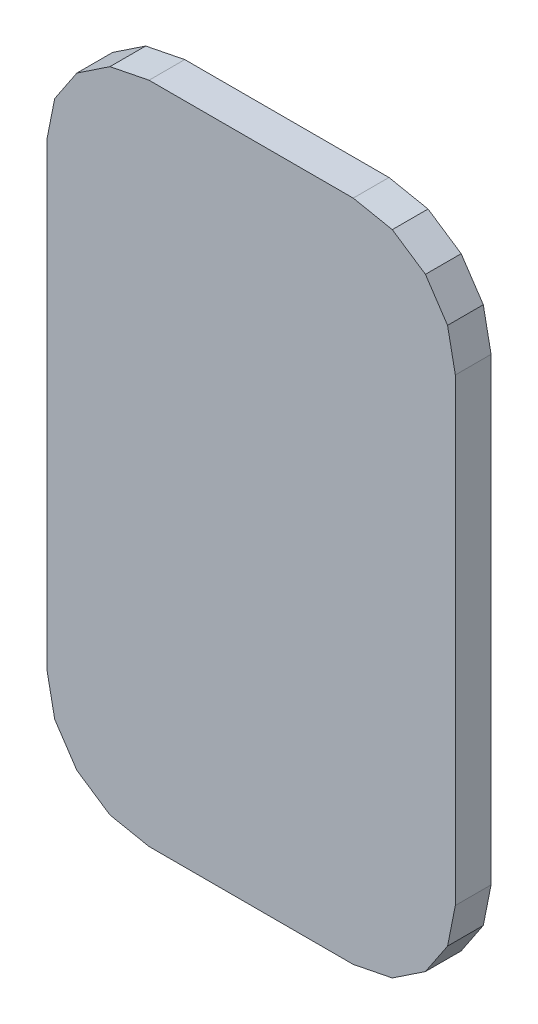
ISO-10303-21;
HEADER;
FILE_DESCRIPTION(('STEP AP214'),'2;1');
FILE_NAME('part.step','',(''),(''),'','','');
FILE_SCHEMA(('AUTOMOTIVE_DESIGN { 1 0 10303 214 1 1 1 1 }'));
ENDSEC;
DATA;
#1=APPLICATION_CONTEXT('core data for automotive mechanical design processes');
#2=APPLICATION_PROTOCOL_DEFINITION('international standard','automotive_design',2000,#1);
#3=PRODUCT_CONTEXT('',#1,'mechanical');
#4=PRODUCT('Part','Part','',(#3));
#5=PRODUCT_RELATED_PRODUCT_CATEGORY('part','',(#4));
#6=PRODUCT_DEFINITION_FORMATION('','',#4);
#7=PRODUCT_DEFINITION_CONTEXT('part definition',#1,'design');
#8=PRODUCT_DEFINITION('design','',#6,#7);
#9=PRODUCT_DEFINITION_SHAPE('','',#8);
#10=(LENGTH_UNIT() NAMED_UNIT(*) SI_UNIT(.MILLI.,.METRE.));
#11=(NAMED_UNIT(*) PLANE_ANGLE_UNIT() SI_UNIT($,.RADIAN.));
#12=(NAMED_UNIT(*) SI_UNIT($,.STERADIAN.) SOLID_ANGLE_UNIT());
#13=UNCERTAINTY_MEASURE_WITH_UNIT(LENGTH_MEASURE(1.E-05),#10,'distance_accuracy_value','');
#14=(GEOMETRIC_REPRESENTATION_CONTEXT(3) GLOBAL_UNCERTAINTY_ASSIGNED_CONTEXT((#13)) GLOBAL_UNIT_ASSIGNED_CONTEXT((#10,
#11,#12)) REPRESENTATION_CONTEXT('',''));
#15=CARTESIAN_POINT('',(0.,0.,0.));
#16=DIRECTION('',(0.,0.,1.));
#17=DIRECTION('',(1.,0.,0.));
#18=AXIS2_PLACEMENT_3D('',#15,#16,#17);
#19=CARTESIAN_POINT('',(88.5,-136.015,1.635));
#20=DIRECTION('',(0.,0.,-1.));
#21=DIRECTION('',(0.,-1.,0.));
#22=AXIS2_PLACEMENT_3D('',#19,#20,#21);
#23=PLANE('',#22);
#24=DIRECTION('',(0.980785174844701,-0.19509085269394,0.));
#25=VECTOR('',#24,1.);
#26=CARTESIAN_POINT('',(88.6,-135.69,1.635));
#27=LINE('',#26,#25);
#28=CARTESIAN_POINT('',(88.6,-135.69,1.635));
#29=VERTEX_POINT('',#28);
#30=CARTESIAN_POINT('',(88.638268,-135.697612,1.635));
#31=VERTEX_POINT('',#30);
#32=EDGE_CURVE('E20',#29,#31,#27,.T.);
#33=ORIENTED_EDGE('',*,*,#32,.F.);
#34=DIRECTION('',(1.,0.,0.));
#35=VECTOR('',#34,1.);
#36=CARTESIAN_POINT('',(88.4,-135.69,1.635));
#37=LINE('',#36,#35);
#38=CARTESIAN_POINT('',(88.4,-135.69,1.635));
#39=VERTEX_POINT('',#38);
#40=EDGE_CURVE('E377',#39,#29,#37,.T.);
#41=ORIENTED_EDGE('',*,*,#40,.F.);
#42=DIRECTION('',(0.980785174844701,0.19509085269394,0.));
#43=VECTOR('',#42,1.);
#44=CARTESIAN_POINT('',(88.361732,-135.697612,1.635));
#45=LINE('',#44,#43);
#46=CARTESIAN_POINT('',(88.361732,-135.697612,1.635));
#47=VERTEX_POINT('',#46);
#48=EDGE_CURVE('E349',#47,#39,#45,.T.);
#49=ORIENTED_EDGE('',*,*,#48,.F.);
#50=DIRECTION('',(0.831478130960079,0.555557483736053,0.));
#51=VECTOR('',#50,1.);
#52=CARTESIAN_POINT('',(88.329289,-135.719289,1.635));
#53=LINE('',#52,#51);
#54=CARTESIAN_POINT('',(88.329289,-135.719289,1.635));
#55=VERTEX_POINT('',#54);
#56=EDGE_CURVE('E417',#55,#47,#53,.T.);
#57=ORIENTED_EDGE('',*,*,#56,.F.);
#58=DIRECTION('',(0.555557483734899,0.831478130960849,0.));
#59=VECTOR('',#58,1.);
#60=CARTESIAN_POINT('',(88.307612,-135.751732,1.635));
#61=LINE('',#60,#59);
#62=CARTESIAN_POINT('',(88.307612,-135.751732,1.635));
#63=VERTEX_POINT('',#62);
#64=EDGE_CURVE('E257',#63,#55,#61,.T.);
#65=ORIENTED_EDGE('',*,*,#64,.F.);
#66=DIRECTION('',(0.195090852694903,0.98078517484451,0.));
#67=VECTOR('',#66,1.);
#68=CARTESIAN_POINT('',(88.3,-135.79,1.635));
#69=LINE('',#68,#67);
#70=CARTESIAN_POINT('',(88.3,-135.79,1.635));
#71=VERTEX_POINT('',#70);
#72=EDGE_CURVE('E402',#71,#63,#69,.T.);
#73=ORIENTED_EDGE('',*,*,#72,.F.);
#74=DIRECTION('',(0.,1.,0.));
#75=VECTOR('',#74,1.);
#76=CARTESIAN_POINT('',(88.3,-136.24,1.635));
#77=LINE('',#76,#75);
#78=CARTESIAN_POINT('',(88.3,-136.24,1.635));
#79=VERTEX_POINT('',#78);
#80=EDGE_CURVE('E390',#79,#71,#77,.T.);
#81=ORIENTED_EDGE('',*,*,#80,.F.);
#82=DIRECTION('',(-0.195090852694903,0.98078517484451,0.));
#83=VECTOR('',#82,1.);
#84=CARTESIAN_POINT('',(88.307612,-136.278268,1.635));
#85=LINE('',#84,#83);
#86=CARTESIAN_POINT('',(88.307612,-136.278268,1.635));
#87=VERTEX_POINT('',#86);
#88=EDGE_CURVE('E237',#87,#79,#85,.T.);
#89=ORIENTED_EDGE('',*,*,#88,.F.);
#90=DIRECTION('',(-0.555557483734899,0.831478130960849,0.));
#91=VECTOR('',#90,1.);
#92=CARTESIAN_POINT('',(88.329289,-136.310711,1.635));
#93=LINE('',#92,#91);
#94=CARTESIAN_POINT('',(88.329289,-136.310711,1.635));
#95=VERTEX_POINT('',#94);
#96=EDGE_CURVE('E361',#95,#87,#93,.T.);
#97=ORIENTED_EDGE('',*,*,#96,.F.);
#98=DIRECTION('',(-0.831478130960079,0.555557483736053,0.));
#99=VECTOR('',#98,1.);
#100=CARTESIAN_POINT('',(88.361732,-136.332388,1.635));
#101=LINE('',#100,#99);
#102=CARTESIAN_POINT('',(88.361732,-136.332388,1.635));
#103=VERTEX_POINT('',#102);
#104=EDGE_CURVE('E302',#103,#95,#101,.T.);
#105=ORIENTED_EDGE('',*,*,#104,.F.);
#106=DIRECTION('',(-0.980785174844701,0.19509085269394,0.));
#107=VECTOR('',#106,1.);
#108=CARTESIAN_POINT('',(88.4,-136.34,1.635));
#109=LINE('',#108,#107);
#110=CARTESIAN_POINT('',(88.4,-136.34,1.635));
#111=VERTEX_POINT('',#110);
#112=EDGE_CURVE('E226',#111,#103,#109,.T.);
#113=ORIENTED_EDGE('',*,*,#112,.F.);
#114=DIRECTION('',(-1.,0.,0.));
#115=VECTOR('',#114,1.);
#116=CARTESIAN_POINT('',(88.6,-136.34,1.635));
#117=LINE('',#116,#115);
#118=CARTESIAN_POINT('',(88.6,-136.34,1.635));
#119=VERTEX_POINT('',#118);
#120=EDGE_CURVE('E329',#119,#111,#117,.T.);
#121=ORIENTED_EDGE('',*,*,#120,.F.);
#122=DIRECTION('',(-0.980785174844701,-0.19509085269394,0.));
#123=VECTOR('',#122,1.);
#124=CARTESIAN_POINT('',(88.638268,-136.332388,1.635));
#125=LINE('',#124,#123);
#126=CARTESIAN_POINT('',(88.638268,-136.332388,1.635));
#127=VERTEX_POINT('',#126);
#128=EDGE_CURVE('E298',#127,#119,#125,.T.);
#129=ORIENTED_EDGE('',*,*,#128,.F.);
#130=DIRECTION('',(-0.831478130960079,-0.555557483736053,0.));
#131=VECTOR('',#130,1.);
#132=CARTESIAN_POINT('',(88.670711,-136.310711,1.635));
#133=LINE('',#132,#131);
#134=CARTESIAN_POINT('',(88.670711,-136.310711,1.635));
#135=VERTEX_POINT('',#134);
#136=EDGE_CURVE('E311',#135,#127,#133,.T.);
#137=ORIENTED_EDGE('',*,*,#136,.F.);
#138=DIRECTION('',(-0.555557483734899,-0.831478130960849,0.));
#139=VECTOR('',#138,1.);
#140=CARTESIAN_POINT('',(88.692388,-136.278268,1.635));
#141=LINE('',#140,#139);
#142=CARTESIAN_POINT('',(88.692388,-136.278268,1.635));
#143=VERTEX_POINT('',#142);
#144=EDGE_CURVE('E251',#143,#135,#141,.T.);
#145=ORIENTED_EDGE('',*,*,#144,.F.);
#146=DIRECTION('',(-0.195090852694903,-0.98078517484451,0.));
#147=VECTOR('',#146,1.);
#148=CARTESIAN_POINT('',(88.7,-136.24,1.635));
#149=LINE('',#148,#147);
#150=CARTESIAN_POINT('',(88.7,-136.24,1.635));
#151=VERTEX_POINT('',#150);
#152=EDGE_CURVE('E232',#151,#143,#149,.T.);
#153=ORIENTED_EDGE('',*,*,#152,.F.);
#154=DIRECTION('',(0.,-1.,0.));
#155=VECTOR('',#154,1.);
#156=CARTESIAN_POINT('',(88.7,-135.79,1.635));
#157=LINE('',#156,#155);
#158=CARTESIAN_POINT('',(88.7,-135.79,1.635));
#159=VERTEX_POINT('',#158);
#160=EDGE_CURVE('E276',#159,#151,#157,.T.);
#161=ORIENTED_EDGE('',*,*,#160,.F.);
#162=DIRECTION('',(0.195090852694903,-0.98078517484451,0.));
#163=VECTOR('',#162,1.);
#164=CARTESIAN_POINT('',(88.692388,-135.751732,1.635));
#165=LINE('',#164,#163);
#166=CARTESIAN_POINT('',(88.692388,-135.751732,1.635));
#167=VERTEX_POINT('',#166);
#168=EDGE_CURVE('E271',#167,#159,#165,.T.);
#169=ORIENTED_EDGE('',*,*,#168,.F.);
#170=DIRECTION('',(0.555557483734899,-0.831478130960849,0.));
#171=VECTOR('',#170,1.);
#172=CARTESIAN_POINT('',(88.670711,-135.719289,1.635));
#173=LINE('',#172,#171);
#174=CARTESIAN_POINT('',(88.670711,-135.719289,1.635));
#175=VERTEX_POINT('',#174);
#176=EDGE_CURVE('E213',#175,#167,#173,.T.);
#177=ORIENTED_EDGE('',*,*,#176,.F.);
#178=DIRECTION('',(0.831478130960079,-0.555557483736053,0.));
#179=VECTOR('',#178,1.);
#180=CARTESIAN_POINT('',(88.638268,-135.697612,1.635));
#181=LINE('',#180,#179);
#182=EDGE_CURVE('E217',#31,#175,#181,.T.);
#183=ORIENTED_EDGE('',*,*,#182,.F.);
#184=EDGE_LOOP('',(#33,#41,#49,#57,#65,#73,#81,#89,#97,#105,#113,#121,#129,#137,#145,#153,#161,
#169,#177,#183));
#185=FACE_BOUND('',#184,.T.);
#186=ADVANCED_FACE('F17',(#185),#23,.F.);
#187=CARTESIAN_POINT('',(88.5,-136.015,1.6));
#188=DIRECTION('',(0.,0.,-1.));
#189=DIRECTION('',(0.,-1.,0.));
#190=AXIS2_PLACEMENT_3D('',#187,#188,#189);
#191=PLANE('',#190);
#192=DIRECTION('',(0.831478130960079,-0.555557483736053,0.));
#193=VECTOR('',#192,1.);
#194=CARTESIAN_POINT('',(88.638268,-135.697612,1.6));
#195=LINE('',#194,#193);
#196=CARTESIAN_POINT('',(88.638268,-135.697612,1.6));
#197=VERTEX_POINT('',#196);
#198=CARTESIAN_POINT('',(88.670711,-135.719289,1.6));
#199=VERTEX_POINT('',#198);
#200=EDGE_CURVE('E200',#197,#199,#195,.T.);
#201=ORIENTED_EDGE('',*,*,#200,.T.);
#202=DIRECTION('',(0.555557483734899,-0.831478130960849,0.));
#203=VECTOR('',#202,1.);
#204=CARTESIAN_POINT('',(88.670711,-135.719289,1.6));
#205=LINE('',#204,#203);
#206=CARTESIAN_POINT('',(88.692388,-135.751732,1.6));
#207=VERTEX_POINT('',#206);
#208=EDGE_CURVE('E263',#199,#207,#205,.T.);
#209=ORIENTED_EDGE('',*,*,#208,.T.);
#210=DIRECTION('',(0.195090852694903,-0.98078517484451,0.));
#211=VECTOR('',#210,1.);
#212=CARTESIAN_POINT('',(88.692388,-135.751732,1.6));
#213=LINE('',#212,#211);
#214=CARTESIAN_POINT('',(88.7,-135.79,1.6));
#215=VERTEX_POINT('',#214);
#216=EDGE_CURVE('E272',#207,#215,#213,.T.);
#217=ORIENTED_EDGE('',*,*,#216,.T.);
#218=DIRECTION('',(0.,-1.,0.));
#219=VECTOR('',#218,1.);
#220=CARTESIAN_POINT('',(88.7,-135.79,1.6));
#221=LINE('',#220,#219);
#222=CARTESIAN_POINT('',(88.7,-136.24,1.6));
#223=VERTEX_POINT('',#222);
#224=EDGE_CURVE('E236',#215,#223,#221,.T.);
#225=ORIENTED_EDGE('',*,*,#224,.T.);
#226=DIRECTION('',(-0.195090852694903,-0.98078517484451,0.));
#227=VECTOR('',#226,1.);
#228=CARTESIAN_POINT('',(88.7,-136.24,1.6));
#229=LINE('',#228,#227);
#230=CARTESIAN_POINT('',(88.692388,-136.278268,1.6));
#231=VERTEX_POINT('',#230);
#232=EDGE_CURVE('E231',#223,#231,#229,.T.);
#233=ORIENTED_EDGE('',*,*,#232,.T.);
#234=DIRECTION('',(-0.555557483734899,-0.831478130960849,0.));
#235=VECTOR('',#234,1.);
#236=CARTESIAN_POINT('',(88.692388,-136.278268,1.6));
#237=LINE('',#236,#235);
#238=CARTESIAN_POINT('',(88.670711,-136.310711,1.6));
#239=VERTEX_POINT('',#238);
#240=EDGE_CURVE('E250',#231,#239,#237,.T.);
#241=ORIENTED_EDGE('',*,*,#240,.T.);
#242=DIRECTION('',(-0.831478130960079,-0.555557483736053,0.));
#243=VECTOR('',#242,1.);
#244=CARTESIAN_POINT('',(88.670711,-136.310711,1.6));
#245=LINE('',#244,#243);
#246=CARTESIAN_POINT('',(88.638268,-136.332388,1.6));
#247=VERTEX_POINT('',#246);
#248=EDGE_CURVE('E319',#239,#247,#245,.T.);
#249=ORIENTED_EDGE('',*,*,#248,.T.);
#250=DIRECTION('',(-0.980785174844701,-0.19509085269394,0.));
#251=VECTOR('',#250,1.);
#252=CARTESIAN_POINT('',(88.638268,-136.332388,1.6));
#253=LINE('',#252,#251);
#254=CARTESIAN_POINT('',(88.6,-136.34,1.6));
#255=VERTEX_POINT('',#254);
#256=EDGE_CURVE('E297',#247,#255,#253,.T.);
#257=ORIENTED_EDGE('',*,*,#256,.T.);
#258=DIRECTION('',(-1.,0.,0.));
#259=VECTOR('',#258,1.);
#260=CARTESIAN_POINT('',(88.6,-136.34,1.6));
#261=LINE('',#260,#259);
#262=CARTESIAN_POINT('',(88.4,-136.34,1.6));
#263=VERTEX_POINT('',#262);
#264=EDGE_CURVE('E337',#255,#263,#261,.T.);
#265=ORIENTED_EDGE('',*,*,#264,.T.);
#266=DIRECTION('',(-0.980785174844701,0.19509085269394,0.));
#267=VECTOR('',#266,1.);
#268=CARTESIAN_POINT('',(88.4,-136.34,1.6));
#269=LINE('',#268,#267);
#270=CARTESIAN_POINT('',(88.361732,-136.332388,1.6));
#271=VERTEX_POINT('',#270);
#272=EDGE_CURVE('E307',#263,#271,#269,.T.);
#273=ORIENTED_EDGE('',*,*,#272,.T.);
#274=DIRECTION('',(-0.831478130960079,0.555557483736053,0.));
#275=VECTOR('',#274,1.);
#276=CARTESIAN_POINT('',(88.361732,-136.332388,1.6));
#277=LINE('',#276,#275);
#278=CARTESIAN_POINT('',(88.329289,-136.310711,1.6));
#279=VERTEX_POINT('',#278);
#280=EDGE_CURVE('E357',#271,#279,#277,.T.);
#281=ORIENTED_EDGE('',*,*,#280,.T.);
#282=DIRECTION('',(-0.555557483734899,0.831478130960849,0.));
#283=VECTOR('',#282,1.);
#284=CARTESIAN_POINT('',(88.329289,-136.310711,1.6));
#285=LINE('',#284,#283);
#286=CARTESIAN_POINT('',(88.307612,-136.278268,1.6));
#287=VERTEX_POINT('',#286);
#288=EDGE_CURVE('E242',#279,#287,#285,.T.);
#289=ORIENTED_EDGE('',*,*,#288,.T.);
#290=DIRECTION('',(-0.195090852694903,0.98078517484451,0.));
#291=VECTOR('',#290,1.);
#292=CARTESIAN_POINT('',(88.307612,-136.278268,1.6));
#293=LINE('',#292,#291);
#294=CARTESIAN_POINT('',(88.3,-136.24,1.6));
#295=VERTEX_POINT('',#294);
#296=EDGE_CURVE('E386',#287,#295,#293,.T.);
#297=ORIENTED_EDGE('',*,*,#296,.T.);
#298=DIRECTION('',(0.,1.,0.));
#299=VECTOR('',#298,1.);
#300=CARTESIAN_POINT('',(88.3,-136.24,1.6));
#301=LINE('',#300,#299);
#302=CARTESIAN_POINT('',(88.3,-135.79,1.6));
#303=VERTEX_POINT('',#302);
#304=EDGE_CURVE('E398',#295,#303,#301,.T.);
#305=ORIENTED_EDGE('',*,*,#304,.T.);
#306=DIRECTION('',(0.195090852694903,0.98078517484451,0.));
#307=VECTOR('',#306,1.);
#308=CARTESIAN_POINT('',(88.3,-135.79,1.6));
#309=LINE('',#308,#307);
#310=CARTESIAN_POINT('',(88.307612,-135.751732,1.6));
#311=VERTEX_POINT('',#310);
#312=EDGE_CURVE('E253',#303,#311,#309,.T.);
#313=ORIENTED_EDGE('',*,*,#312,.T.);
#314=DIRECTION('',(0.555557483734899,0.831478130960849,0.));
#315=VECTOR('',#314,1.);
#316=CARTESIAN_POINT('',(88.307612,-135.751732,1.6));
#317=LINE('',#316,#315);
#318=CARTESIAN_POINT('',(88.329289,-135.719289,1.6));
#319=VERTEX_POINT('',#318);
#320=EDGE_CURVE('E373',#311,#319,#317,.T.);
#321=ORIENTED_EDGE('',*,*,#320,.T.);
#322=DIRECTION('',(0.831478130960079,0.555557483736053,0.));
#323=VECTOR('',#322,1.);
#324=CARTESIAN_POINT('',(88.329289,-135.719289,1.6));
#325=LINE('',#324,#323);
#326=CARTESIAN_POINT('',(88.361732,-135.697612,1.6));
#327=VERTEX_POINT('',#326);
#328=EDGE_CURVE('E345',#319,#327,#325,.T.);
#329=ORIENTED_EDGE('',*,*,#328,.T.);
#330=DIRECTION('',(0.980785174844701,0.19509085269394,0.));
#331=VECTOR('',#330,1.);
#332=CARTESIAN_POINT('',(88.361732,-135.697612,1.6));
#333=LINE('',#332,#331);
#334=CARTESIAN_POINT('',(88.4,-135.69,1.6));
#335=VERTEX_POINT('',#334);
#336=EDGE_CURVE('E382',#327,#335,#333,.T.);
#337=ORIENTED_EDGE('',*,*,#336,.T.);
#338=DIRECTION('',(1.,0.,0.));
#339=VECTOR('',#338,1.);
#340=CARTESIAN_POINT('',(88.4,-135.69,1.6));
#341=LINE('',#340,#339);
#342=CARTESIAN_POINT('',(88.6,-135.69,1.6));
#343=VERTEX_POINT('',#342);
#344=EDGE_CURVE('E203',#335,#343,#341,.T.);
#345=ORIENTED_EDGE('',*,*,#344,.T.);
#346=DIRECTION('',(0.980785174844701,-0.19509085269394,0.));
#347=VECTOR('',#346,1.);
#348=CARTESIAN_POINT('',(88.6,-135.69,1.6));
#349=LINE('',#348,#347);
#350=EDGE_CURVE('E11',#343,#197,#349,.T.);
#351=ORIENTED_EDGE('',*,*,#350,.T.);
#352=EDGE_LOOP('',(#201,#209,#217,#225,#233,#241,#249,#257,#265,#273,#281,#289,#297,#305,#313,
#321,#329,#337,#345,#351));
#353=FACE_BOUND('',#352,.T.);
#354=ADVANCED_FACE('F198',(#353),#191,.T.);
#355=CARTESIAN_POINT('',(88.6,-135.69,1.6));
#356=DIRECTION('',(0.19509085269394,0.980785174844701,0.));
#357=DIRECTION('',(0.,0.,-1.));
#358=AXIS2_PLACEMENT_3D('',#355,#356,#357);
#359=PLANE('',#358);
#360=DIRECTION('',(0.,0.,1.));
#361=VECTOR('',#360,1.);
#362=CARTESIAN_POINT('',(88.6,-135.69,1.6));
#363=LINE('',#362,#361);
#364=EDGE_CURVE('E381',#343,#29,#363,.T.);
#365=ORIENTED_EDGE('',*,*,#364,.T.);
#366=ORIENTED_EDGE('',*,*,#32,.T.);
#367=DIRECTION('',(0.,0.,1.));
#368=VECTOR('',#367,1.);
#369=CARTESIAN_POINT('',(88.638268,-135.697612,1.6));
#370=LINE('',#369,#368);
#371=EDGE_CURVE('E209',#197,#31,#370,.T.);
#372=ORIENTED_EDGE('',*,*,#371,.F.);
#373=ORIENTED_EDGE('',*,*,#350,.F.);
#374=EDGE_LOOP('',(#365,#366,#372,#373));
#375=FACE_BOUND('',#374,.T.);
#376=ADVANCED_FACE('F215',(#375),#359,.T.);
#377=CARTESIAN_POINT('',(88.4,-135.69,1.6));
#378=DIRECTION('',(0.,1.,0.));
#379=DIRECTION('',(1.,0.,0.));
#380=AXIS2_PLACEMENT_3D('',#377,#378,#379);
#381=PLANE('',#380);
#382=DIRECTION('',(0.,0.,1.));
#383=VECTOR('',#382,1.);
#384=CARTESIAN_POINT('',(88.4,-135.69,1.6));
#385=LINE('',#384,#383);
#386=EDGE_CURVE('E427',#335,#39,#385,.T.);
#387=ORIENTED_EDGE('',*,*,#386,.T.);
#388=ORIENTED_EDGE('',*,*,#40,.T.);
#389=ORIENTED_EDGE('',*,*,#364,.F.);
#390=ORIENTED_EDGE('',*,*,#344,.F.);
#391=EDGE_LOOP('',(#387,#388,#389,#390));
#392=FACE_BOUND('',#391,.T.);
#393=ADVANCED_FACE('F622',(#392),#381,.T.);
#394=CARTESIAN_POINT('',(88.361732,-135.697612,1.6));
#395=DIRECTION('',(-0.19509085269394,0.980785174844701,0.));
#396=DIRECTION('',(0.,0.,1.));
#397=AXIS2_PLACEMENT_3D('',#394,#395,#396);
#398=PLANE('',#397);
#399=DIRECTION('',(0.,0.,1.));
#400=VECTOR('',#399,1.);
#401=CARTESIAN_POINT('',(88.361732,-135.697612,1.6));
#402=LINE('',#401,#400);
#403=EDGE_CURVE('E350',#327,#47,#402,.T.);
#404=ORIENTED_EDGE('',*,*,#403,.T.);
#405=ORIENTED_EDGE('',*,*,#48,.T.);
#406=ORIENTED_EDGE('',*,*,#386,.F.);
#407=ORIENTED_EDGE('',*,*,#336,.F.);
#408=EDGE_LOOP('',(#404,#405,#406,#407));
#409=FACE_BOUND('',#408,.T.);
#410=ADVANCED_FACE('F612',(#409),#398,.T.);
#411=CARTESIAN_POINT('',(88.329289,-135.719289,1.6));
#412=DIRECTION('',(-0.555557483736053,0.831478130960079,0.));
#413=DIRECTION('',(0.,0.,1.));
#414=AXIS2_PLACEMENT_3D('',#411,#412,#413);
#415=PLANE('',#414);
#416=DIRECTION('',(0.,0.,1.));
#417=VECTOR('',#416,1.);
#418=CARTESIAN_POINT('',(88.329289,-135.719289,1.6));
#419=LINE('',#418,#417);
#420=EDGE_CURVE('E369',#319,#55,#419,.T.);
#421=ORIENTED_EDGE('',*,*,#420,.T.);
#422=ORIENTED_EDGE('',*,*,#56,.T.);
#423=ORIENTED_EDGE('',*,*,#403,.F.);
#424=ORIENTED_EDGE('',*,*,#328,.F.);
#425=EDGE_LOOP('',(#421,#422,#423,#424));
#426=FACE_BOUND('',#425,.T.);
#427=ADVANCED_FACE('F603',(#426),#415,.T.);
#428=CARTESIAN_POINT('',(88.307612,-135.751732,1.6));
#429=DIRECTION('',(-0.831478130960849,0.555557483734899,0.));
#430=DIRECTION('',(0.,0.,1.));
#431=AXIS2_PLACEMENT_3D('',#428,#429,#430);
#432=PLANE('',#431);
#433=DIRECTION('',(0.,0.,1.));
#434=VECTOR('',#433,1.);
#435=CARTESIAN_POINT('',(88.307612,-135.751732,1.6));
#436=LINE('',#435,#434);
#437=EDGE_CURVE('E258',#311,#63,#436,.T.);
#438=ORIENTED_EDGE('',*,*,#437,.T.);
#439=ORIENTED_EDGE('',*,*,#64,.T.);
#440=ORIENTED_EDGE('',*,*,#420,.F.);
#441=ORIENTED_EDGE('',*,*,#320,.F.);
#442=EDGE_LOOP('',(#438,#439,#440,#441));
#443=FACE_BOUND('',#442,.T.);
#444=ADVANCED_FACE('F593',(#443),#432,.T.);
#445=CARTESIAN_POINT('',(88.3,-135.79,1.6));
#446=DIRECTION('',(-0.98078517484451,0.195090852694903,0.));
#447=DIRECTION('',(0.,0.,1.));
#448=AXIS2_PLACEMENT_3D('',#445,#446,#447);
#449=PLANE('',#448);
#450=DIRECTION('',(0.,0.,1.));
#451=VECTOR('',#450,1.);
#452=CARTESIAN_POINT('',(88.3,-135.79,1.6));
#453=LINE('',#452,#451);
#454=EDGE_CURVE('E394',#303,#71,#453,.T.);
#455=ORIENTED_EDGE('',*,*,#454,.T.);
#456=ORIENTED_EDGE('',*,*,#72,.T.);
#457=ORIENTED_EDGE('',*,*,#437,.F.);
#458=ORIENTED_EDGE('',*,*,#312,.F.);
#459=EDGE_LOOP('',(#455,#456,#457,#458));
#460=FACE_BOUND('',#459,.T.);
#461=ADVANCED_FACE('F584',(#460),#449,.T.);
#462=CARTESIAN_POINT('',(88.3,-136.24,1.6));
#463=DIRECTION('',(-1.,0.,0.));
#464=DIRECTION('',(0.,0.,1.));
#465=AXIS2_PLACEMENT_3D('',#462,#463,#464);
#466=PLANE('',#465);
#467=DIRECTION('',(0.,0.,1.));
#468=VECTOR('',#467,1.);
#469=CARTESIAN_POINT('',(88.3,-136.24,1.6));
#470=LINE('',#469,#468);
#471=EDGE_CURVE('E241',#295,#79,#470,.T.);
#472=ORIENTED_EDGE('',*,*,#471,.T.);
#473=ORIENTED_EDGE('',*,*,#80,.T.);
#474=ORIENTED_EDGE('',*,*,#454,.F.);
#475=ORIENTED_EDGE('',*,*,#304,.F.);
#476=EDGE_LOOP('',(#472,#473,#474,#475));
#477=FACE_BOUND('',#476,.T.);
#478=ADVANCED_FACE('F575',(#477),#466,.T.);
#479=CARTESIAN_POINT('',(88.307612,-136.278268,1.6));
#480=DIRECTION('',(-0.98078517484451,-0.195090852694903,0.));
#481=DIRECTION('',(-0.195090852694903,0.98078517484451,0.));
#482=AXIS2_PLACEMENT_3D('',#479,#480,#481);
#483=PLANE('',#482);
#484=DIRECTION('',(0.,0.,1.));
#485=VECTOR('',#484,1.);
#486=CARTESIAN_POINT('',(88.307612,-136.278268,1.6));
#487=LINE('',#486,#485);
#488=EDGE_CURVE('E364',#287,#87,#487,.T.);
#489=ORIENTED_EDGE('',*,*,#488,.T.);
#490=ORIENTED_EDGE('',*,*,#88,.T.);
#491=ORIENTED_EDGE('',*,*,#471,.F.);
#492=ORIENTED_EDGE('',*,*,#296,.F.);
#493=EDGE_LOOP('',(#489,#490,#491,#492));
#494=FACE_BOUND('',#493,.T.);
#495=ADVANCED_FACE('F564',(#494),#483,.T.);
#496=CARTESIAN_POINT('',(88.329289,-136.310711,1.6));
#497=DIRECTION('',(-0.831478130960849,-0.555557483734899,0.));
#498=DIRECTION('',(-0.555557483734899,0.831478130960849,0.));
#499=AXIS2_PLACEMENT_3D('',#496,#497,#498);
#500=PLANE('',#499);
#501=DIRECTION('',(0.,0.,1.));
#502=VECTOR('',#501,1.);
#503=CARTESIAN_POINT('',(88.329289,-136.310711,1.6));
#504=LINE('',#503,#502);
#505=EDGE_CURVE('E306',#279,#95,#504,.T.);
#506=ORIENTED_EDGE('',*,*,#505,.T.);
#507=ORIENTED_EDGE('',*,*,#96,.T.);
#508=ORIENTED_EDGE('',*,*,#488,.F.);
#509=ORIENTED_EDGE('',*,*,#288,.F.);
#510=EDGE_LOOP('',(#506,#507,#508,#509));
#511=FACE_BOUND('',#510,.T.);
#512=ADVANCED_FACE('F554',(#511),#500,.T.);
#513=CARTESIAN_POINT('',(88.361732,-136.332388,1.6));
#514=DIRECTION('',(-0.555557483736053,-0.831478130960079,0.));
#515=DIRECTION('',(-0.831478130960079,0.555557483736053,0.));
#516=AXIS2_PLACEMENT_3D('',#513,#514,#515);
#517=PLANE('',#516);
#518=DIRECTION('',(0.,0.,1.));
#519=VECTOR('',#518,1.);
#520=CARTESIAN_POINT('',(88.361732,-136.332388,1.6));
#521=LINE('',#520,#519);
#522=EDGE_CURVE('E341',#271,#103,#521,.T.);
#523=ORIENTED_EDGE('',*,*,#522,.T.);
#524=ORIENTED_EDGE('',*,*,#104,.T.);
#525=ORIENTED_EDGE('',*,*,#505,.F.);
#526=ORIENTED_EDGE('',*,*,#280,.F.);
#527=EDGE_LOOP('',(#523,#524,#525,#526));
#528=FACE_BOUND('',#527,.T.);
#529=ADVANCED_FACE('F545',(#528),#517,.T.);
#530=CARTESIAN_POINT('',(88.4,-136.34,1.6));
#531=DIRECTION('',(-0.19509085269394,-0.980785174844701,0.));
#532=DIRECTION('',(-0.980785174844701,0.19509085269394,0.));
#533=AXIS2_PLACEMENT_3D('',#530,#531,#532);
#534=PLANE('',#533);
#535=DIRECTION('',(0.,0.,1.));
#536=VECTOR('',#535,1.);
#537=CARTESIAN_POINT('',(88.4,-136.34,1.6));
#538=LINE('',#537,#536);
#539=EDGE_CURVE('E333',#263,#111,#538,.T.);
#540=ORIENTED_EDGE('',*,*,#539,.T.);
#541=ORIENTED_EDGE('',*,*,#112,.T.);
#542=ORIENTED_EDGE('',*,*,#522,.F.);
#543=ORIENTED_EDGE('',*,*,#272,.F.);
#544=EDGE_LOOP('',(#540,#541,#542,#543));
#545=FACE_BOUND('',#544,.T.);
#546=ADVANCED_FACE('F535',(#545),#534,.T.);
#547=CARTESIAN_POINT('',(88.6,-136.34,1.6));
#548=DIRECTION('',(0.,-1.,0.));
#549=DIRECTION('',(0.,0.,-1.));
#550=AXIS2_PLACEMENT_3D('',#547,#548,#549);
#551=PLANE('',#550);
#552=DIRECTION('',(0.,0.,1.));
#553=VECTOR('',#552,1.);
#554=CARTESIAN_POINT('',(88.6,-136.34,1.6));
#555=LINE('',#554,#553);
#556=EDGE_CURVE('E293',#255,#119,#555,.T.);
#557=ORIENTED_EDGE('',*,*,#556,.T.);
#558=ORIENTED_EDGE('',*,*,#120,.T.);
#559=ORIENTED_EDGE('',*,*,#539,.F.);
#560=ORIENTED_EDGE('',*,*,#264,.F.);
#561=EDGE_LOOP('',(#557,#558,#559,#560));
#562=FACE_BOUND('',#561,.T.);
#563=ADVANCED_FACE('F526',(#562),#551,.T.);
#564=CARTESIAN_POINT('',(88.638268,-136.332388,1.6));
#565=DIRECTION('',(0.19509085269394,-0.980785174844701,0.));
#566=DIRECTION('',(0.,0.,-1.));
#567=AXIS2_PLACEMENT_3D('',#564,#565,#566);
#568=PLANE('',#567);
#569=DIRECTION('',(0.,0.,1.));
#570=VECTOR('',#569,1.);
#571=CARTESIAN_POINT('',(88.638268,-136.332388,1.6));
#572=LINE('',#571,#570);
#573=EDGE_CURVE('E315',#247,#127,#572,.T.);
#574=ORIENTED_EDGE('',*,*,#573,.T.);
#575=ORIENTED_EDGE('',*,*,#128,.T.);
#576=ORIENTED_EDGE('',*,*,#556,.F.);
#577=ORIENTED_EDGE('',*,*,#256,.F.);
#578=EDGE_LOOP('',(#574,#575,#576,#577));
#579=FACE_BOUND('',#578,.T.);
#580=ADVANCED_FACE('F516',(#579),#568,.T.);
#581=CARTESIAN_POINT('',(88.670711,-136.310711,1.6));
#582=DIRECTION('',(0.555557483736053,-0.831478130960079,0.));
#583=DIRECTION('',(0.,0.,-1.));
#584=AXIS2_PLACEMENT_3D('',#581,#582,#583);
#585=PLANE('',#584);
#586=DIRECTION('',(0.,0.,1.));
#587=VECTOR('',#586,1.);
#588=CARTESIAN_POINT('',(88.670711,-136.310711,1.6));
#589=LINE('',#588,#587);
#590=EDGE_CURVE('E247',#239,#135,#589,.T.);
#591=ORIENTED_EDGE('',*,*,#590,.T.);
#592=ORIENTED_EDGE('',*,*,#136,.T.);
#593=ORIENTED_EDGE('',*,*,#573,.F.);
#594=ORIENTED_EDGE('',*,*,#248,.F.);
#595=EDGE_LOOP('',(#591,#592,#593,#594));
#596=FACE_BOUND('',#595,.T.);
#597=ADVANCED_FACE('F506',(#596),#585,.T.);
#598=CARTESIAN_POINT('',(88.692388,-136.278268,1.6));
#599=DIRECTION('',(0.831478130960849,-0.555557483734899,0.));
#600=DIRECTION('',(0.,0.,-1.));
#601=AXIS2_PLACEMENT_3D('',#598,#599,#600);
#602=PLANE('',#601);
#603=DIRECTION('',(0.,0.,1.));
#604=VECTOR('',#603,1.);
#605=CARTESIAN_POINT('',(88.692388,-136.278268,1.6));
#606=LINE('',#605,#604);
#607=EDGE_CURVE('E227',#231,#143,#606,.T.);
#608=ORIENTED_EDGE('',*,*,#607,.T.);
#609=ORIENTED_EDGE('',*,*,#144,.T.);
#610=ORIENTED_EDGE('',*,*,#590,.F.);
#611=ORIENTED_EDGE('',*,*,#240,.F.);
#612=EDGE_LOOP('',(#608,#609,#610,#611));
#613=FACE_BOUND('',#612,.T.);
#614=ADVANCED_FACE('F495',(#613),#602,.T.);
#615=CARTESIAN_POINT('',(88.7,-136.24,1.6));
#616=DIRECTION('',(0.98078517484451,-0.195090852694903,0.));
#617=DIRECTION('',(0.,0.,-1.));
#618=AXIS2_PLACEMENT_3D('',#615,#616,#617);
#619=PLANE('',#618);
#620=DIRECTION('',(0.,0.,1.));
#621=VECTOR('',#620,1.);
#622=CARTESIAN_POINT('',(88.7,-136.24,1.6));
#623=LINE('',#622,#621);
#624=EDGE_CURVE('E246',#223,#151,#623,.T.);
#625=ORIENTED_EDGE('',*,*,#624,.T.);
#626=ORIENTED_EDGE('',*,*,#152,.T.);
#627=ORIENTED_EDGE('',*,*,#607,.F.);
#628=ORIENTED_EDGE('',*,*,#232,.F.);
#629=EDGE_LOOP('',(#625,#626,#627,#628));
#630=FACE_BOUND('',#629,.T.);
#631=ADVANCED_FACE('F485',(#630),#619,.T.);
#632=CARTESIAN_POINT('',(88.7,-135.79,1.6));
#633=DIRECTION('',(1.,0.,0.));
#634=DIRECTION('',(0.,1.,0.));
#635=AXIS2_PLACEMENT_3D('',#632,#633,#634);
#636=PLANE('',#635);
#637=DIRECTION('',(0.,0.,1.));
#638=VECTOR('',#637,1.);
#639=CARTESIAN_POINT('',(88.7,-135.79,1.6));
#640=LINE('',#639,#638);
#641=EDGE_CURVE('E277',#215,#159,#640,.T.);
#642=ORIENTED_EDGE('',*,*,#641,.T.);
#643=ORIENTED_EDGE('',*,*,#160,.T.);
#644=ORIENTED_EDGE('',*,*,#624,.F.);
#645=ORIENTED_EDGE('',*,*,#224,.F.);
#646=EDGE_LOOP('',(#642,#643,#644,#645));
#647=FACE_BOUND('',#646,.T.);
#648=ADVANCED_FACE('F474',(#647),#636,.T.);
#649=CARTESIAN_POINT('',(88.692388,-135.751732,1.6));
#650=DIRECTION('',(0.98078517484451,0.195090852694903,0.));
#651=DIRECTION('',(0.,0.,-1.));
#652=AXIS2_PLACEMENT_3D('',#649,#650,#651);
#653=PLANE('',#652);
#654=DIRECTION('',(0.,0.,1.));
#655=VECTOR('',#654,1.);
#656=CARTESIAN_POINT('',(88.692388,-135.751732,1.6));
#657=LINE('',#656,#655);
#658=EDGE_CURVE('E259',#207,#167,#657,.T.);
#659=ORIENTED_EDGE('',*,*,#658,.T.);
#660=ORIENTED_EDGE('',*,*,#168,.T.);
#661=ORIENTED_EDGE('',*,*,#641,.F.);
#662=ORIENTED_EDGE('',*,*,#216,.F.);
#663=EDGE_LOOP('',(#659,#660,#661,#662));
#664=FACE_BOUND('',#663,.T.);
#665=ADVANCED_FACE('F463',(#664),#653,.T.);
#666=CARTESIAN_POINT('',(88.670711,-135.719289,1.6));
#667=DIRECTION('',(0.831478130960849,0.555557483734899,0.));
#668=DIRECTION('',(0.,0.,-1.));
#669=AXIS2_PLACEMENT_3D('',#666,#667,#668);
#670=PLANE('',#669);
#671=DIRECTION('',(0.,0.,1.));
#672=VECTOR('',#671,1.);
#673=CARTESIAN_POINT('',(88.670711,-135.719289,1.6));
#674=LINE('',#673,#672);
#675=EDGE_CURVE('E211',#199,#175,#674,.T.);
#676=ORIENTED_EDGE('',*,*,#675,.T.);
#677=ORIENTED_EDGE('',*,*,#176,.T.);
#678=ORIENTED_EDGE('',*,*,#658,.F.);
#679=ORIENTED_EDGE('',*,*,#208,.F.);
#680=EDGE_LOOP('',(#676,#677,#678,#679));
#681=FACE_BOUND('',#680,.T.);
#682=ADVANCED_FACE('F452',(#681),#670,.T.);
#683=CARTESIAN_POINT('',(88.638268,-135.697612,1.6));
#684=DIRECTION('',(0.555557483736053,0.831478130960079,0.));
#685=DIRECTION('',(0.,0.,-1.));
#686=AXIS2_PLACEMENT_3D('',#683,#684,#685);
#687=PLANE('',#686);
#688=ORIENTED_EDGE('',*,*,#371,.T.);
#689=ORIENTED_EDGE('',*,*,#182,.T.);
#690=ORIENTED_EDGE('',*,*,#675,.F.);
#691=ORIENTED_EDGE('',*,*,#200,.F.);
#692=EDGE_LOOP('',(#688,#689,#690,#691));
#693=FACE_BOUND('',#692,.T.);
#694=ADVANCED_FACE('F207',(#693),#687,.T.);
#695=CLOSED_SHELL('',(#186,#354,#376,#393,#410,#427,#444,#461,#478,#495,#512,#529,#546,#563,
#580,#597,#614,#631,#648,#665,#682,#694));
#696=MANIFOLD_SOLID_BREP('B1',#695);
#697=ADVANCED_BREP_SHAPE_REPRESENTATION('',(#18,#696),#14);
#698=SHAPE_DEFINITION_REPRESENTATION(#9,#697);
ENDSEC;
END-ISO-10303-21;
